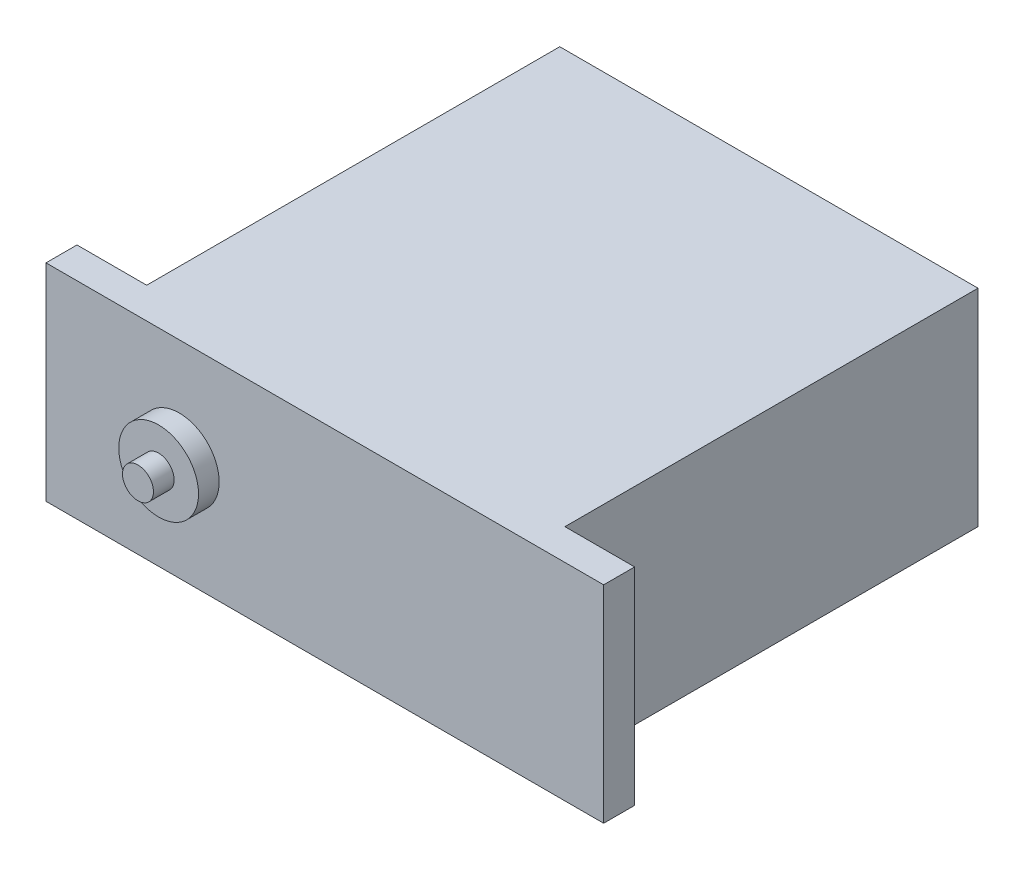
ISO-10303-21;
HEADER;
FILE_DESCRIPTION(('STEP AP214'),'2;1');
FILE_NAME('part.step','',(''),(''),'','','');
FILE_SCHEMA(('AUTOMOTIVE_DESIGN { 1 0 10303 214 1 1 1 1 }'));
ENDSEC;
DATA;
#1=APPLICATION_CONTEXT('core data for automotive mechanical design processes');
#2=APPLICATION_PROTOCOL_DEFINITION('international standard','automotive_design',2000,#1);
#3=PRODUCT_CONTEXT('',#1,'mechanical');
#4=PRODUCT('Part','Part','',(#3));
#5=PRODUCT_RELATED_PRODUCT_CATEGORY('part','',(#4));
#6=PRODUCT_DEFINITION_FORMATION('','',#4);
#7=PRODUCT_DEFINITION_CONTEXT('part definition',#1,'design');
#8=PRODUCT_DEFINITION('design','',#6,#7);
#9=PRODUCT_DEFINITION_SHAPE('','',#8);
#10=(LENGTH_UNIT() NAMED_UNIT(*) SI_UNIT(.MILLI.,.METRE.));
#11=(NAMED_UNIT(*) PLANE_ANGLE_UNIT() SI_UNIT($,.RADIAN.));
#12=(NAMED_UNIT(*) SI_UNIT($,.STERADIAN.) SOLID_ANGLE_UNIT());
#13=UNCERTAINTY_MEASURE_WITH_UNIT(LENGTH_MEASURE(1.E-05),#10,'distance_accuracy_value','');
#14=(GEOMETRIC_REPRESENTATION_CONTEXT(3) GLOBAL_UNCERTAINTY_ASSIGNED_CONTEXT((#13)) GLOBAL_UNIT_ASSIGNED_CONTEXT((#10,
#11,#12)) REPRESENTATION_CONTEXT('',''));
#15=CARTESIAN_POINT('',(0.,0.,0.));
#16=DIRECTION('',(0.,0.,1.));
#17=DIRECTION('',(1.,0.,0.));
#18=AXIS2_PLACEMENT_3D('',#15,#16,#17);
#19=CARTESIAN_POINT('',(20.25,-10.,40.));
#20=DIRECTION('',(-1.,0.,0.));
#21=DIRECTION('',(0.,0.,1.));
#22=AXIS2_PLACEMENT_3D('',#19,#20,#21);
#23=PLANE('',#22);
#24=DIRECTION('',(0.,1.,0.));
#25=VECTOR('',#24,1.);
#26=CARTESIAN_POINT('',(20.25,-10.,0.));
#27=LINE('',#26,#25);
#28=CARTESIAN_POINT('',(20.25,-10.,0.));
#29=VERTEX_POINT('',#28);
#30=CARTESIAN_POINT('',(20.25,10.,0.));
#31=VERTEX_POINT('',#30);
#32=EDGE_CURVE('E142',#29,#31,#27,.T.);
#33=ORIENTED_EDGE('',*,*,#32,.T.);
#34=DIRECTION('',(0.,0.,-1.));
#35=VECTOR('',#34,1.);
#36=CARTESIAN_POINT('',(20.25,10.,40.));
#37=LINE('',#36,#35);
#38=CARTESIAN_POINT('',(20.25,10.,40.));
#39=VERTEX_POINT('',#38);
#40=EDGE_CURVE('E84',#39,#31,#37,.T.);
#41=ORIENTED_EDGE('',*,*,#40,.F.);
#42=DIRECTION('',(0.,1.,0.));
#43=VECTOR('',#42,1.);
#44=CARTESIAN_POINT('',(20.25,-10.,40.));
#45=LINE('',#44,#43);
#46=CARTESIAN_POINT('',(20.25,-10.,40.));
#47=VERTEX_POINT('',#46);
#48=EDGE_CURVE('E152',#47,#39,#45,.T.);
#49=ORIENTED_EDGE('',*,*,#48,.F.);
#50=DIRECTION('',(0.,0.,-1.));
#51=VECTOR('',#50,1.);
#52=CARTESIAN_POINT('',(20.25,-10.,40.));
#53=LINE('',#52,#51);
#54=EDGE_CURVE('E57',#47,#29,#53,.T.);
#55=ORIENTED_EDGE('',*,*,#54,.T.);
#56=EDGE_LOOP('',(#33,#41,#49,#55));
#57=FACE_BOUND('',#56,.T.);
#58=ADVANCED_FACE('F39',(#57),#23,.F.);
#59=CARTESIAN_POINT('',(-20.25,10.,40.));
#60=DIRECTION('',(0.,-1.,0.));
#61=DIRECTION('',(0.,0.,-1.));
#62=AXIS2_PLACEMENT_3D('',#59,#60,#61);
#63=PLANE('',#62);
#64=DIRECTION('',(-1.,0.,0.));
#65=VECTOR('',#64,1.);
#66=CARTESIAN_POINT('',(-20.25,10.,0.));
#67=LINE('',#66,#65);
#68=CARTESIAN_POINT('',(-20.25,10.,0.));
#69=VERTEX_POINT('',#68);
#70=EDGE_CURVE('E146',#31,#69,#67,.T.);
#71=ORIENTED_EDGE('',*,*,#70,.T.);
#72=DIRECTION('',(0.,0.,-1.));
#73=VECTOR('',#72,1.);
#74=CARTESIAN_POINT('',(-20.25,10.,40.));
#75=LINE('',#74,#73);
#76=CARTESIAN_POINT('',(-20.25,10.,40.));
#77=VERTEX_POINT('',#76);
#78=EDGE_CURVE('E170',#77,#69,#75,.T.);
#79=ORIENTED_EDGE('',*,*,#78,.F.);
#80=DIRECTION('',(-1.,0.,0.));
#81=VECTOR('',#80,1.);
#82=CARTESIAN_POINT('',(-27.,10.,40.));
#83=LINE('',#82,#81);
#84=CARTESIAN_POINT('',(-27.,10.,40.));
#85=VERTEX_POINT('',#84);
#86=EDGE_CURVE('E206',#77,#85,#83,.T.);
#87=ORIENTED_EDGE('',*,*,#86,.T.);
#88=DIRECTION('',(0.,0.,-1.));
#89=VECTOR('',#88,1.);
#90=CARTESIAN_POINT('',(-27.,10.,43.));
#91=LINE('',#90,#89);
#92=CARTESIAN_POINT('',(-27.,10.,43.));
#93=VERTEX_POINT('',#92);
#94=EDGE_CURVE('E121',#93,#85,#91,.T.);
#95=ORIENTED_EDGE('',*,*,#94,.F.);
#96=DIRECTION('',(-1.,0.,0.));
#97=VECTOR('',#96,1.);
#98=CARTESIAN_POINT('',(-27.,10.,43.));
#99=LINE('',#98,#97);
#100=CARTESIAN_POINT('',(27.,10.,43.));
#101=VERTEX_POINT('',#100);
#102=EDGE_CURVE('E113',#101,#93,#99,.T.);
#103=ORIENTED_EDGE('',*,*,#102,.F.);
#104=DIRECTION('',(0.,0.,-1.));
#105=VECTOR('',#104,1.);
#106=CARTESIAN_POINT('',(27.,10.,43.));
#107=LINE('',#106,#105);
#108=CARTESIAN_POINT('',(27.,10.,40.));
#109=VERTEX_POINT('',#108);
#110=EDGE_CURVE('E118',#101,#109,#107,.T.);
#111=ORIENTED_EDGE('',*,*,#110,.T.);
#112=EDGE_CURVE('E209',#109,#39,#83,.T.);
#113=ORIENTED_EDGE('',*,*,#112,.T.);
#114=ORIENTED_EDGE('',*,*,#40,.T.);
#115=EDGE_LOOP('',(#71,#79,#87,#95,#103,#111,#113,#114));
#116=FACE_BOUND('',#115,.T.);
#117=ADVANCED_FACE('F115',(#116),#63,.F.);
#118=CARTESIAN_POINT('',(-20.25,-10.,40.));
#119=DIRECTION('',(1.,0.,0.));
#120=DIRECTION('',(0.,0.,-1.));
#121=AXIS2_PLACEMENT_3D('',#118,#119,#120);
#122=PLANE('',#121);
#123=DIRECTION('',(0.,-1.,0.));
#124=VECTOR('',#123,1.);
#125=CARTESIAN_POINT('',(-20.25,-10.,0.));
#126=LINE('',#125,#124);
#127=CARTESIAN_POINT('',(-20.25,-10.,0.));
#128=VERTEX_POINT('',#127);
#129=EDGE_CURVE('E76',#69,#128,#126,.T.);
#130=ORIENTED_EDGE('',*,*,#129,.T.);
#131=DIRECTION('',(0.,0.,-1.));
#132=VECTOR('',#131,1.);
#133=CARTESIAN_POINT('',(-20.25,-10.,40.));
#134=LINE('',#133,#132);
#135=CARTESIAN_POINT('',(-20.25,-10.,40.));
#136=VERTEX_POINT('',#135);
#137=EDGE_CURVE('E167',#136,#128,#134,.T.);
#138=ORIENTED_EDGE('',*,*,#137,.F.);
#139=DIRECTION('',(0.,-1.,0.));
#140=VECTOR('',#139,1.);
#141=CARTESIAN_POINT('',(-20.25,-10.,40.));
#142=LINE('',#141,#140);
#143=EDGE_CURVE('E155',#77,#136,#142,.T.);
#144=ORIENTED_EDGE('',*,*,#143,.F.);
#145=ORIENTED_EDGE('',*,*,#78,.T.);
#146=EDGE_LOOP('',(#130,#138,#144,#145));
#147=FACE_BOUND('',#146,.T.);
#148=ADVANCED_FACE('F197',(#147),#122,.F.);
#149=CARTESIAN_POINT('',(-20.25,-10.,40.));
#150=DIRECTION('',(0.,1.,0.));
#151=DIRECTION('',(0.,0.,1.));
#152=AXIS2_PLACEMENT_3D('',#149,#150,#151);
#153=PLANE('',#152);
#154=DIRECTION('',(1.,0.,0.));
#155=VECTOR('',#154,1.);
#156=CARTESIAN_POINT('',(-20.25,-10.,0.));
#157=LINE('',#156,#155);
#158=EDGE_CURVE('E79',#128,#29,#157,.T.);
#159=ORIENTED_EDGE('',*,*,#158,.T.);
#160=ORIENTED_EDGE('',*,*,#54,.F.);
#161=DIRECTION('',(1.,0.,0.));
#162=VECTOR('',#161,1.);
#163=CARTESIAN_POINT('',(-27.,-10.,40.));
#164=LINE('',#163,#162);
#165=CARTESIAN_POINT('',(27.,-10.,40.));
#166=VERTEX_POINT('',#165);
#167=EDGE_CURVE('E219',#47,#166,#164,.T.);
#168=ORIENTED_EDGE('',*,*,#167,.T.);
#169=DIRECTION('',(0.,0.,-1.));
#170=VECTOR('',#169,1.);
#171=CARTESIAN_POINT('',(27.,-10.,43.));
#172=LINE('',#171,#170);
#173=CARTESIAN_POINT('',(27.,-10.,43.));
#174=VERTEX_POINT('',#173);
#175=EDGE_CURVE('E222',#174,#166,#172,.T.);
#176=ORIENTED_EDGE('',*,*,#175,.F.);
#177=DIRECTION('',(1.,0.,0.));
#178=VECTOR('',#177,1.);
#179=CARTESIAN_POINT('',(-27.,-10.,43.));
#180=LINE('',#179,#178);
#181=CARTESIAN_POINT('',(-27.,-10.,43.));
#182=VERTEX_POINT('',#181);
#183=EDGE_CURVE('E131',#182,#174,#180,.T.);
#184=ORIENTED_EDGE('',*,*,#183,.F.);
#185=DIRECTION('',(0.,0.,-1.));
#186=VECTOR('',#185,1.);
#187=CARTESIAN_POINT('',(-27.,-10.,43.));
#188=LINE('',#187,#186);
#189=CARTESIAN_POINT('',(-27.,-10.,40.));
#190=VERTEX_POINT('',#189);
#191=EDGE_CURVE('E148',#182,#190,#188,.T.);
#192=ORIENTED_EDGE('',*,*,#191,.T.);
#193=EDGE_CURVE('E136',#190,#136,#164,.T.);
#194=ORIENTED_EDGE('',*,*,#193,.T.);
#195=ORIENTED_EDGE('',*,*,#137,.T.);
#196=EDGE_LOOP('',(#159,#160,#168,#176,#184,#192,#194,#195));
#197=FACE_BOUND('',#196,.T.);
#198=ADVANCED_FACE('F227',(#197),#153,.F.);
#199=CARTESIAN_POINT('',(0.,0.,0.));
#200=DIRECTION('',(0.,0.,-1.));
#201=DIRECTION('',(-1.,0.,0.));
#202=AXIS2_PLACEMENT_3D('',#199,#200,#201);
#203=PLANE('',#202);
#204=ORIENTED_EDGE('',*,*,#32,.F.);
#205=ORIENTED_EDGE('',*,*,#158,.F.);
#206=ORIENTED_EDGE('',*,*,#129,.F.);
#207=ORIENTED_EDGE('',*,*,#70,.F.);
#208=EDGE_LOOP('',(#204,#205,#206,#207));
#209=FACE_BOUND('',#208,.T.);
#210=ADVANCED_FACE('F200',(#209),#203,.T.);
#211=CARTESIAN_POINT('',(0.,0.,40.));
#212=DIRECTION('',(0.,0.,-1.));
#213=DIRECTION('',(-1.,0.,0.));
#214=AXIS2_PLACEMENT_3D('',#211,#212,#213);
#215=PLANE('',#214);
#216=ORIENTED_EDGE('',*,*,#167,.F.);
#217=ORIENTED_EDGE('',*,*,#48,.T.);
#218=ORIENTED_EDGE('',*,*,#112,.F.);
#219=DIRECTION('',(0.,1.,0.));
#220=VECTOR('',#219,1.);
#221=CARTESIAN_POINT('',(27.,-10.,40.));
#222=LINE('',#221,#220);
#223=EDGE_CURVE('E140',#166,#109,#222,.T.);
#224=ORIENTED_EDGE('',*,*,#223,.F.);
#225=EDGE_LOOP('',(#216,#217,#218,#224));
#226=FACE_BOUND('',#225,.T.);
#227=ADVANCED_FACE('F189',(#226),#215,.T.);
#228=CARTESIAN_POINT('',(27.,-10.,43.));
#229=DIRECTION('',(-1.,0.,0.));
#230=DIRECTION('',(0.,0.,1.));
#231=AXIS2_PLACEMENT_3D('',#228,#229,#230);
#232=PLANE('',#231);
#233=ORIENTED_EDGE('',*,*,#223,.T.);
#234=ORIENTED_EDGE('',*,*,#110,.F.);
#235=DIRECTION('',(0.,1.,0.));
#236=VECTOR('',#235,1.);
#237=CARTESIAN_POINT('',(27.,-10.,43.));
#238=LINE('',#237,#236);
#239=EDGE_CURVE('E126',#174,#101,#238,.T.);
#240=ORIENTED_EDGE('',*,*,#239,.F.);
#241=ORIENTED_EDGE('',*,*,#175,.T.);
#242=EDGE_LOOP('',(#233,#234,#240,#241));
#243=FACE_BOUND('',#242,.T.);
#244=ADVANCED_FACE('F138',(#243),#232,.F.);
#245=CARTESIAN_POINT('',(-27.,-10.,43.));
#246=DIRECTION('',(1.,0.,0.));
#247=DIRECTION('',(0.,0.,-1.));
#248=AXIS2_PLACEMENT_3D('',#245,#246,#247);
#249=PLANE('',#248);
#250=DIRECTION('',(0.,-1.,0.));
#251=VECTOR('',#250,1.);
#252=CARTESIAN_POINT('',(-27.,-10.,40.));
#253=LINE('',#252,#251);
#254=EDGE_CURVE('E207',#85,#190,#253,.T.);
#255=ORIENTED_EDGE('',*,*,#254,.T.);
#256=ORIENTED_EDGE('',*,*,#191,.F.);
#257=DIRECTION('',(0.,-1.,0.));
#258=VECTOR('',#257,1.);
#259=CARTESIAN_POINT('',(-27.,-10.,43.));
#260=LINE('',#259,#258);
#261=EDGE_CURVE('E125',#93,#182,#260,.T.);
#262=ORIENTED_EDGE('',*,*,#261,.F.);
#263=ORIENTED_EDGE('',*,*,#94,.T.);
#264=EDGE_LOOP('',(#255,#256,#262,#263));
#265=FACE_BOUND('',#264,.T.);
#266=ADVANCED_FACE('F181',(#265),#249,.F.);
#267=CARTESIAN_POINT('',(0.,0.,43.));
#268=DIRECTION('',(0.,0.,-1.));
#269=DIRECTION('',(-1.,0.,0.));
#270=AXIS2_PLACEMENT_3D('',#267,#268,#269);
#271=PLANE('',#270);
#272=CARTESIAN_POINT('',(-14.0924819125511,0.,43.));
#273=DIRECTION('',(0.,0.,-1.));
#274=DIRECTION('',(-1.,0.,0.));
#275=AXIS2_PLACEMENT_3D('',#272,#273,#274);
#276=CIRCLE('',#275,3.86297332580624);
#277=CARTESIAN_POINT('',(-17.9554552383574,0.,43.));
#278=VERTEX_POINT('',#277);
#279=EDGE_CURVE('E42',#278,#278,#276,.F.);
#280=ORIENTED_EDGE('',*,*,#279,.F.);
#281=EDGE_LOOP('',(#280));
#282=FACE_BOUND('',#281,.T.);
#283=ORIENTED_EDGE('',*,*,#239,.T.);
#284=ORIENTED_EDGE('',*,*,#102,.T.);
#285=ORIENTED_EDGE('',*,*,#261,.T.);
#286=ORIENTED_EDGE('',*,*,#183,.T.);
#287=EDGE_LOOP('',(#283,#284,#285,#286));
#288=FACE_BOUND('',#287,.T.);
#289=ADVANCED_FACE('F129',(#282,#288),#271,.F.);
#290=ORIENTED_EDGE('',*,*,#86,.F.);
#291=ORIENTED_EDGE('',*,*,#143,.T.);
#292=ORIENTED_EDGE('',*,*,#193,.F.);
#293=ORIENTED_EDGE('',*,*,#254,.F.);
#294=EDGE_LOOP('',(#290,#291,#292,#293));
#295=FACE_BOUND('',#294,.T.);
#296=ADVANCED_FACE('F180',(#295),#215,.T.);
#297=CARTESIAN_POINT('',(-14.0924819125511,0.,45.));
#298=DIRECTION('',(0.,0.,-1.));
#299=DIRECTION('',(-1.,0.,0.));
#300=AXIS2_PLACEMENT_3D('',#297,#298,#299);
#301=CYLINDRICAL_SURFACE('',#300,3.86297332580624);
#302=CARTESIAN_POINT('',(-14.0924819125511,0.,45.));
#303=DIRECTION('',(0.,0.,1.));
#304=DIRECTION('',(1.,0.,0.));
#305=AXIS2_PLACEMENT_3D('',#302,#303,#304);
#306=CIRCLE('',#305,3.86297332580624);
#307=CARTESIAN_POINT('',(-10.2295085867449,0.,45.));
#308=VERTEX_POINT('',#307);
#309=EDGE_CURVE('E213',#308,#308,#306,.T.);
#310=ORIENTED_EDGE('',*,*,#309,.F.);
#311=EDGE_LOOP('',(#310));
#312=FACE_BOUND('',#311,.T.);
#313=ORIENTED_EDGE('',*,*,#279,.T.);
#314=EDGE_LOOP('',(#313));
#315=FACE_BOUND('',#314,.T.);
#316=ADVANCED_FACE('F177',(#312,#315),#301,.T.);
#317=CARTESIAN_POINT('',(-14.0924819125511,0.,45.));
#318=DIRECTION('',(0.,0.,1.));
#319=DIRECTION('',(1.,0.,0.));
#320=AXIS2_PLACEMENT_3D('',#317,#318,#319);
#321=PLANE('',#320);
#322=CARTESIAN_POINT('',(-14.0924819125511,0.,45.));
#323=DIRECTION('',(0.,0.,1.));
#324=DIRECTION('',(1.,0.,0.));
#325=AXIS2_PLACEMENT_3D('',#322,#323,#324);
#326=CIRCLE('',#325,1.5);
#327=CARTESIAN_POINT('',(-12.5924819125511,0.,45.));
#328=VERTEX_POINT('',#327);
#329=EDGE_CURVE('E11',#328,#328,#326,.T.);
#330=ORIENTED_EDGE('',*,*,#329,.F.);
#331=EDGE_LOOP('',(#330));
#332=FACE_BOUND('',#331,.T.);
#333=ORIENTED_EDGE('',*,*,#309,.T.);
#334=EDGE_LOOP('',(#333));
#335=FACE_BOUND('',#334,.T.);
#336=ADVANCED_FACE('F245',(#332,#335),#321,.T.);
#337=CARTESIAN_POINT('',(-14.0924819125511,0.,47.));
#338=DIRECTION('',(0.,0.,-1.));
#339=DIRECTION('',(-1.,0.,0.));
#340=AXIS2_PLACEMENT_3D('',#337,#338,#339);
#341=CYLINDRICAL_SURFACE('',#340,1.5);
#342=CARTESIAN_POINT('',(-14.0924819125511,0.,47.));
#343=DIRECTION('',(0.,0.,1.));
#344=DIRECTION('',(1.,0.,0.));
#345=AXIS2_PLACEMENT_3D('',#342,#343,#344);
#346=CIRCLE('',#345,1.5);
#347=CARTESIAN_POINT('',(-12.5924819125511,0.,47.));
#348=VERTEX_POINT('',#347);
#349=EDGE_CURVE('E234',#348,#348,#346,.T.);
#350=ORIENTED_EDGE('',*,*,#349,.F.);
#351=EDGE_LOOP('',(#350));
#352=FACE_BOUND('',#351,.T.);
#353=ORIENTED_EDGE('',*,*,#329,.T.);
#354=EDGE_LOOP('',(#353));
#355=FACE_BOUND('',#354,.T.);
#356=ADVANCED_FACE('F242',(#352,#355),#341,.T.);
#357=CARTESIAN_POINT('',(-14.0924819125511,0.,47.));
#358=DIRECTION('',(0.,0.,1.));
#359=DIRECTION('',(1.,0.,0.));
#360=AXIS2_PLACEMENT_3D('',#357,#358,#359);
#361=PLANE('',#360);
#362=ORIENTED_EDGE('',*,*,#349,.T.);
#363=EDGE_LOOP('',(#362));
#364=FACE_BOUND('',#363,.T.);
#365=ADVANCED_FACE('F240',(#364),#361,.T.);
#366=CLOSED_SHELL('',(#58,#117,#148,#198,#210,#227,#244,#266,#289,#296,#316,#336,#356,#365));
#367=MANIFOLD_SOLID_BREP('B2',#366);
#368=ADVANCED_BREP_SHAPE_REPRESENTATION('',(#18,#367),#14);
#369=SHAPE_DEFINITION_REPRESENTATION(#9,#368);
ENDSEC;
END-ISO-10303-21;
